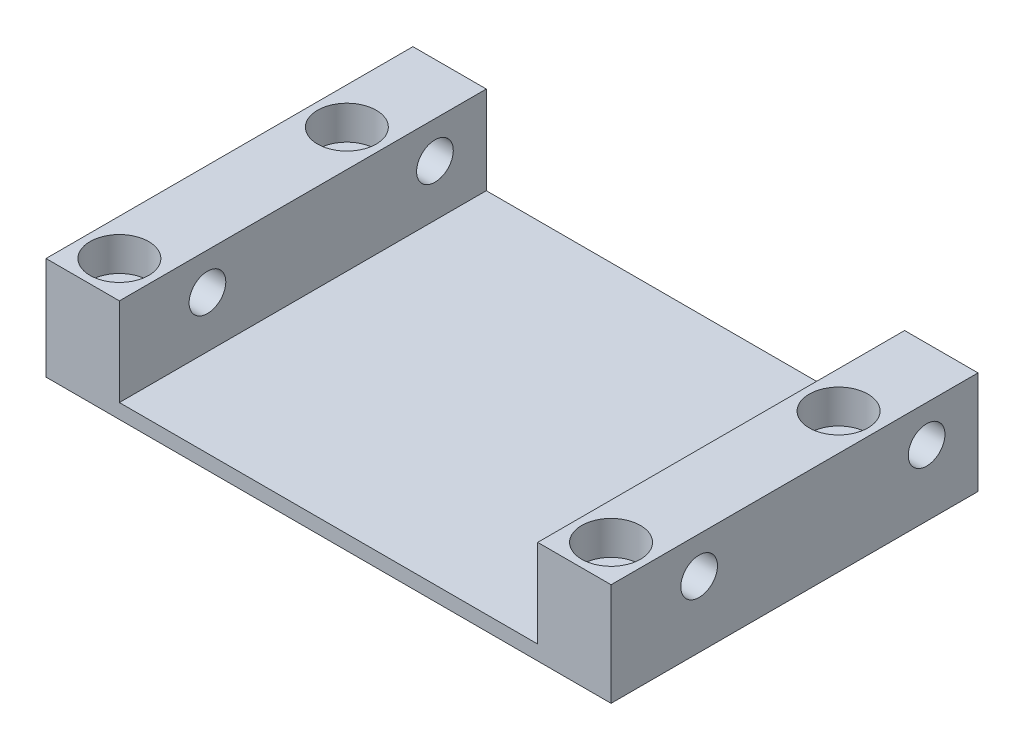
ISO-10303-21;
HEADER;
FILE_DESCRIPTION(('STEP AP214'),'2;1');
FILE_NAME('part.step','',(''),(''),'','','');
FILE_SCHEMA(('AUTOMOTIVE_DESIGN { 1 0 10303 214 1 1 1 1 }'));
ENDSEC;
DATA;
#1=APPLICATION_CONTEXT('core data for automotive mechanical design processes');
#2=APPLICATION_PROTOCOL_DEFINITION('international standard','automotive_design',2000,#1);
#3=PRODUCT_CONTEXT('',#1,'mechanical');
#4=PRODUCT('Part','Part','',(#3));
#5=PRODUCT_RELATED_PRODUCT_CATEGORY('part','',(#4));
#6=PRODUCT_DEFINITION_FORMATION('','',#4);
#7=PRODUCT_DEFINITION_CONTEXT('part definition',#1,'design');
#8=PRODUCT_DEFINITION('design','',#6,#7);
#9=PRODUCT_DEFINITION_SHAPE('','',#8);
#10=(LENGTH_UNIT() NAMED_UNIT(*) SI_UNIT(.MILLI.,.METRE.));
#11=(NAMED_UNIT(*) PLANE_ANGLE_UNIT() SI_UNIT($,.RADIAN.));
#12=(NAMED_UNIT(*) SI_UNIT($,.STERADIAN.) SOLID_ANGLE_UNIT());
#13=UNCERTAINTY_MEASURE_WITH_UNIT(LENGTH_MEASURE(1.E-05),#10,'distance_accuracy_value','');
#14=(GEOMETRIC_REPRESENTATION_CONTEXT(3) GLOBAL_UNCERTAINTY_ASSIGNED_CONTEXT((#13)) GLOBAL_UNIT_ASSIGNED_CONTEXT((#10,
#11,#12)) REPRESENTATION_CONTEXT('',''));
#15=CARTESIAN_POINT('',(0.,0.,0.));
#16=DIRECTION('',(0.,0.,1.));
#17=DIRECTION('',(1.,0.,0.));
#18=AXIS2_PLACEMENT_3D('',#15,#16,#17);
#19=CARTESIAN_POINT('',(-28.5,1.99999999999999,-25.));
#20=DIRECTION('',(0.,1.,0.));
#21=DIRECTION('',(0.,0.,1.));
#22=AXIS2_PLACEMENT_3D('',#19,#20,#21);
#23=PLANE('',#22);
#24=DIRECTION('',(-1.,0.,0.));
#25=VECTOR('',#24,1.);
#26=CARTESIAN_POINT('',(-28.5,1.99999999999999,25.));
#27=LINE('',#26,#25);
#28=CARTESIAN_POINT('',(28.5,1.99999999999999,25.));
#29=VERTEX_POINT('',#28);
#30=CARTESIAN_POINT('',(-28.5,1.99999999999999,25.));
#31=VERTEX_POINT('',#30);
#32=EDGE_CURVE('E144',#29,#31,#27,.T.);
#33=ORIENTED_EDGE('',*,*,#32,.F.);
#34=DIRECTION('',(0.,0.,1.));
#35=VECTOR('',#34,1.);
#36=CARTESIAN_POINT('',(28.5,1.99999999999999,-25.));
#37=LINE('',#36,#35);
#38=CARTESIAN_POINT('',(28.5,1.99999999999999,-25.));
#39=VERTEX_POINT('',#38);
#40=EDGE_CURVE('E11',#39,#29,#37,.T.);
#41=ORIENTED_EDGE('',*,*,#40,.F.);
#42=DIRECTION('',(-1.,0.,0.));
#43=VECTOR('',#42,1.);
#44=CARTESIAN_POINT('',(-28.5,1.99999999999999,-25.));
#45=LINE('',#44,#43);
#46=CARTESIAN_POINT('',(-28.5,1.99999999999999,-25.));
#47=VERTEX_POINT('',#46);
#48=EDGE_CURVE('E167',#39,#47,#45,.T.);
#49=ORIENTED_EDGE('',*,*,#48,.T.);
#50=DIRECTION('',(0.,0.,1.));
#51=VECTOR('',#50,1.);
#52=CARTESIAN_POINT('',(-28.5,1.99999999999999,-25.));
#53=LINE('',#52,#51);
#54=EDGE_CURVE('E95',#47,#31,#53,.T.);
#55=ORIENTED_EDGE('',*,*,#54,.T.);
#56=EDGE_LOOP('',(#33,#41,#49,#55));
#57=FACE_BOUND('',#56,.T.);
#58=ADVANCED_FACE('F37',(#57),#23,.T.);
#59=CARTESIAN_POINT('',(28.5,1.99999999999999,-25.));
#60=DIRECTION('',(-1.,0.,0.));
#61=DIRECTION('',(0.,-1.,0.));
#62=AXIS2_PLACEMENT_3D('',#59,#60,#61);
#63=PLANE('',#62);
#64=CARTESIAN_POINT('',(28.5,8.99999999999999,13.));
#65=DIRECTION('',(-1.,0.,0.));
#66=DIRECTION('',(0.,-1.,0.));
#67=AXIS2_PLACEMENT_3D('',#64,#65,#66);
#68=CIRCLE('',#67,2.5);
#69=CARTESIAN_POINT('',(28.5,6.49999999999999,13.));
#70=VERTEX_POINT('',#69);
#71=EDGE_CURVE('E183',#70,#70,#68,.T.);
#72=ORIENTED_EDGE('',*,*,#71,.F.);
#73=EDGE_LOOP('',(#72));
#74=FACE_BOUND('',#73,.T.);
#75=CARTESIAN_POINT('',(28.5,8.99999999999999,-18.));
#76=DIRECTION('',(-1.,0.,0.));
#77=DIRECTION('',(0.,-1.,0.));
#78=AXIS2_PLACEMENT_3D('',#75,#76,#77);
#79=CIRCLE('',#78,2.5);
#80=CARTESIAN_POINT('',(28.5,6.49999999999999,-18.));
#81=VERTEX_POINT('',#80);
#82=EDGE_CURVE('E148',#81,#81,#79,.T.);
#83=ORIENTED_EDGE('',*,*,#82,.F.);
#84=EDGE_LOOP('',(#83));
#85=FACE_BOUND('',#84,.T.);
#86=DIRECTION('',(0.,-1.,0.));
#87=VECTOR('',#86,1.);
#88=CARTESIAN_POINT('',(28.5,1.99999999999999,25.));
#89=LINE('',#88,#87);
#90=CARTESIAN_POINT('',(28.5,14.,25.));
#91=VERTEX_POINT('',#90);
#92=EDGE_CURVE('E165',#91,#29,#89,.T.);
#93=ORIENTED_EDGE('',*,*,#92,.F.);
#94=DIRECTION('',(0.,0.,1.));
#95=VECTOR('',#94,1.);
#96=CARTESIAN_POINT('',(28.5,14.,-25.));
#97=LINE('',#96,#95);
#98=CARTESIAN_POINT('',(28.5,14.,-25.));
#99=VERTEX_POINT('',#98);
#100=EDGE_CURVE('E46',#99,#91,#97,.T.);
#101=ORIENTED_EDGE('',*,*,#100,.F.);
#102=DIRECTION('',(0.,-1.,0.));
#103=VECTOR('',#102,1.);
#104=CARTESIAN_POINT('',(28.5,1.99999999999999,-25.));
#105=LINE('',#104,#103);
#106=EDGE_CURVE('E129',#99,#39,#105,.T.);
#107=ORIENTED_EDGE('',*,*,#106,.T.);
#108=ORIENTED_EDGE('',*,*,#40,.T.);
#109=EDGE_LOOP('',(#93,#101,#107,#108));
#110=FACE_BOUND('',#109,.T.);
#111=ADVANCED_FACE('F225',(#74,#85,#110),#63,.T.);
#112=CARTESIAN_POINT('',(28.5,14.,-25.));
#113=DIRECTION('',(0.,1.,0.));
#114=DIRECTION('',(-1.,0.,0.));
#115=AXIS2_PLACEMENT_3D('',#112,#113,#114);
#116=PLANE('',#115);
#117=CARTESIAN_POINT('',(33.5,14.,-11.));
#118=DIRECTION('',(0.,1.,0.));
#119=DIRECTION('',(0.,0.,1.));
#120=AXIS2_PLACEMENT_3D('',#117,#118,#119);
#121=CIRCLE('',#120,4.);
#122=CARTESIAN_POINT('',(33.5,14.,-7.00000000000001));
#123=VERTEX_POINT('',#122);
#124=EDGE_CURVE('E314',#123,#123,#121,.T.);
#125=ORIENTED_EDGE('',*,*,#124,.F.);
#126=EDGE_LOOP('',(#125));
#127=FACE_BOUND('',#126,.T.);
#128=CARTESIAN_POINT('',(33.5,14.,20.));
#129=DIRECTION('',(0.,1.,0.));
#130=DIRECTION('',(0.,0.,1.));
#131=AXIS2_PLACEMENT_3D('',#128,#129,#130);
#132=CIRCLE('',#131,4.);
#133=CARTESIAN_POINT('',(33.5,14.,24.));
#134=VERTEX_POINT('',#133);
#135=EDGE_CURVE('E300',#134,#134,#132,.T.);
#136=ORIENTED_EDGE('',*,*,#135,.F.);
#137=EDGE_LOOP('',(#136));
#138=FACE_BOUND('',#137,.T.);
#139=DIRECTION('',(-1.,0.,0.));
#140=VECTOR('',#139,1.);
#141=CARTESIAN_POINT('',(28.5,14.,25.));
#142=LINE('',#141,#140);
#143=CARTESIAN_POINT('',(38.5,14.,25.));
#144=VERTEX_POINT('',#143);
#145=EDGE_CURVE('E115',#144,#91,#142,.T.);
#146=ORIENTED_EDGE('',*,*,#145,.F.);
#147=DIRECTION('',(0.,0.,1.));
#148=VECTOR('',#147,1.);
#149=CARTESIAN_POINT('',(38.5,14.,-25.));
#150=LINE('',#149,#148);
#151=CARTESIAN_POINT('',(38.5,14.,-25.));
#152=VERTEX_POINT('',#151);
#153=EDGE_CURVE('E110',#152,#144,#150,.T.);
#154=ORIENTED_EDGE('',*,*,#153,.F.);
#155=DIRECTION('',(-1.,0.,0.));
#156=VECTOR('',#155,1.);
#157=CARTESIAN_POINT('',(28.5,14.,-25.));
#158=LINE('',#157,#156);
#159=EDGE_CURVE('E113',#152,#99,#158,.T.);
#160=ORIENTED_EDGE('',*,*,#159,.T.);
#161=ORIENTED_EDGE('',*,*,#100,.T.);
#162=EDGE_LOOP('',(#146,#154,#160,#161));
#163=FACE_BOUND('',#162,.T.);
#164=ADVANCED_FACE('F112',(#127,#138,#163),#116,.T.);
#165=CARTESIAN_POINT('',(38.5,14.,-25.));
#166=DIRECTION('',(1.,0.,0.));
#167=DIRECTION('',(0.,0.,-1.));
#168=AXIS2_PLACEMENT_3D('',#165,#166,#167);
#169=PLANE('',#168);
#170=CARTESIAN_POINT('',(38.5,8.99999999999999,13.));
#171=DIRECTION('',(1.,0.,0.));
#172=DIRECTION('',(0.,0.,-1.));
#173=AXIS2_PLACEMENT_3D('',#170,#171,#172);
#174=CIRCLE('',#173,2.5);
#175=CARTESIAN_POINT('',(38.5,8.99999999999999,10.5));
#176=VERTEX_POINT('',#175);
#177=EDGE_CURVE('E191',#176,#176,#174,.T.);
#178=ORIENTED_EDGE('',*,*,#177,.F.);
#179=EDGE_LOOP('',(#178));
#180=FACE_BOUND('',#179,.T.);
#181=CARTESIAN_POINT('',(38.5,8.99999999999999,-18.));
#182=DIRECTION('',(1.,0.,0.));
#183=DIRECTION('',(0.,0.,-1.));
#184=AXIS2_PLACEMENT_3D('',#181,#182,#183);
#185=CIRCLE('',#184,2.5);
#186=CARTESIAN_POINT('',(38.5,8.99999999999999,-20.5));
#187=VERTEX_POINT('',#186);
#188=EDGE_CURVE('E187',#187,#187,#185,.T.);
#189=ORIENTED_EDGE('',*,*,#188,.F.);
#190=EDGE_LOOP('',(#189));
#191=FACE_BOUND('',#190,.T.);
#192=DIRECTION('',(0.,1.,0.));
#193=VECTOR('',#192,1.);
#194=CARTESIAN_POINT('',(38.5,14.,25.));
#195=LINE('',#194,#193);
#196=CARTESIAN_POINT('',(38.5,0.,25.));
#197=VERTEX_POINT('',#196);
#198=EDGE_CURVE('E162',#197,#144,#195,.T.);
#199=ORIENTED_EDGE('',*,*,#198,.F.);
#200=DIRECTION('',(0.,0.,1.));
#201=VECTOR('',#200,1.);
#202=CARTESIAN_POINT('',(38.5,0.,-25.));
#203=LINE('',#202,#201);
#204=CARTESIAN_POINT('',(38.5,0.,-25.));
#205=VERTEX_POINT('',#204);
#206=EDGE_CURVE('E121',#205,#197,#203,.T.);
#207=ORIENTED_EDGE('',*,*,#206,.F.);
#208=DIRECTION('',(0.,1.,0.));
#209=VECTOR('',#208,1.);
#210=CARTESIAN_POINT('',(38.5,14.,-25.));
#211=LINE('',#210,#209);
#212=EDGE_CURVE('E127',#205,#152,#211,.T.);
#213=ORIENTED_EDGE('',*,*,#212,.T.);
#214=ORIENTED_EDGE('',*,*,#153,.T.);
#215=EDGE_LOOP('',(#199,#207,#213,#214));
#216=FACE_BOUND('',#215,.T.);
#217=ADVANCED_FACE('F132',(#180,#191,#216),#169,.T.);
#218=CARTESIAN_POINT('',(38.5,0.,-25.));
#219=DIRECTION('',(0.,-1.,0.));
#220=DIRECTION('',(0.,0.,-1.));
#221=AXIS2_PLACEMENT_3D('',#218,#219,#220);
#222=PLANE('',#221);
#223=CARTESIAN_POINT('',(33.5,0.,-11.));
#224=DIRECTION('',(0.,1.,0.));
#225=DIRECTION('',(0.,0.,1.));
#226=AXIS2_PLACEMENT_3D('',#223,#224,#225);
#227=CIRCLE('',#226,2.25);
#228=CARTESIAN_POINT('',(33.5,0.,-8.75000000000001));
#229=VERTEX_POINT('',#228);
#230=EDGE_CURVE('E303',#229,#229,#227,.T.);
#231=ORIENTED_EDGE('',*,*,#230,.T.);
#232=EDGE_LOOP('',(#231));
#233=FACE_BOUND('',#232,.T.);
#234=CARTESIAN_POINT('',(33.5,0.,20.));
#235=DIRECTION('',(0.,1.,0.));
#236=DIRECTION('',(0.,0.,1.));
#237=AXIS2_PLACEMENT_3D('',#234,#235,#236);
#238=CIRCLE('',#237,2.25);
#239=CARTESIAN_POINT('',(33.5,0.,22.25));
#240=VERTEX_POINT('',#239);
#241=EDGE_CURVE('E291',#240,#240,#238,.T.);
#242=ORIENTED_EDGE('',*,*,#241,.T.);
#243=EDGE_LOOP('',(#242));
#244=FACE_BOUND('',#243,.T.);
#245=CARTESIAN_POINT('',(-33.5,0.,-11.));
#246=DIRECTION('',(0.,1.,0.));
#247=DIRECTION('',(0.,0.,1.));
#248=AXIS2_PLACEMENT_3D('',#245,#246,#247);
#249=CIRCLE('',#248,2.25);
#250=CARTESIAN_POINT('',(-33.5,0.,-8.75000000000001));
#251=VERTEX_POINT('',#250);
#252=EDGE_CURVE('E279',#251,#251,#249,.T.);
#253=ORIENTED_EDGE('',*,*,#252,.T.);
#254=EDGE_LOOP('',(#253));
#255=FACE_BOUND('',#254,.T.);
#256=CARTESIAN_POINT('',(-33.5,0.,20.));
#257=DIRECTION('',(0.,1.,0.));
#258=DIRECTION('',(0.,0.,1.));
#259=AXIS2_PLACEMENT_3D('',#256,#257,#258);
#260=CIRCLE('',#259,2.25);
#261=CARTESIAN_POINT('',(-33.5,0.,22.25));
#262=VERTEX_POINT('',#261);
#263=EDGE_CURVE('E261',#262,#262,#260,.T.);
#264=ORIENTED_EDGE('',*,*,#263,.T.);
#265=EDGE_LOOP('',(#264));
#266=FACE_BOUND('',#265,.T.);
#267=DIRECTION('',(1.,0.,0.));
#268=VECTOR('',#267,1.);
#269=CARTESIAN_POINT('',(38.5,0.,25.));
#270=LINE('',#269,#268);
#271=CARTESIAN_POINT('',(-38.5,0.,25.));
#272=VERTEX_POINT('',#271);
#273=EDGE_CURVE('E159',#272,#197,#270,.T.);
#274=ORIENTED_EDGE('',*,*,#273,.F.);
#275=DIRECTION('',(0.,0.,1.));
#276=VECTOR('',#275,1.);
#277=CARTESIAN_POINT('',(-38.5,0.,-25.));
#278=LINE('',#277,#276);
#279=CARTESIAN_POINT('',(-38.5,0.,-25.));
#280=VERTEX_POINT('',#279);
#281=EDGE_CURVE('E172',#280,#272,#278,.T.);
#282=ORIENTED_EDGE('',*,*,#281,.F.);
#283=DIRECTION('',(1.,0.,0.));
#284=VECTOR('',#283,1.);
#285=CARTESIAN_POINT('',(38.5,0.,-25.));
#286=LINE('',#285,#284);
#287=EDGE_CURVE('E134',#280,#205,#286,.T.);
#288=ORIENTED_EDGE('',*,*,#287,.T.);
#289=ORIENTED_EDGE('',*,*,#206,.T.);
#290=EDGE_LOOP('',(#274,#282,#288,#289));
#291=FACE_BOUND('',#290,.T.);
#292=ADVANCED_FACE('F241',(#233,#244,#255,#266,#291),#222,.T.);
#293=CARTESIAN_POINT('',(-38.5,14.,-25.));
#294=DIRECTION('',(-1.,0.,0.));
#295=DIRECTION('',(0.,0.,1.));
#296=AXIS2_PLACEMENT_3D('',#293,#294,#295);
#297=PLANE('',#296);
#298=CARTESIAN_POINT('',(-38.5,8.99999999999999,13.));
#299=DIRECTION('',(-1.,0.,0.));
#300=DIRECTION('',(0.,0.,1.));
#301=AXIS2_PLACEMENT_3D('',#298,#299,#300);
#302=CIRCLE('',#301,2.5);
#303=CARTESIAN_POINT('',(-38.5,8.99999999999999,15.5));
#304=VERTEX_POINT('',#303);
#305=EDGE_CURVE('E198',#304,#304,#302,.T.);
#306=ORIENTED_EDGE('',*,*,#305,.F.);
#307=EDGE_LOOP('',(#306));
#308=FACE_BOUND('',#307,.T.);
#309=CARTESIAN_POINT('',(-38.5,8.99999999999999,-18.));
#310=DIRECTION('',(-1.,0.,0.));
#311=DIRECTION('',(0.,0.,1.));
#312=AXIS2_PLACEMENT_3D('',#309,#310,#311);
#313=CIRCLE('',#312,2.5);
#314=CARTESIAN_POINT('',(-38.5,8.99999999999999,-15.5));
#315=VERTEX_POINT('',#314);
#316=EDGE_CURVE('E182',#315,#315,#313,.T.);
#317=ORIENTED_EDGE('',*,*,#316,.F.);
#318=EDGE_LOOP('',(#317));
#319=FACE_BOUND('',#318,.T.);
#320=DIRECTION('',(0.,-1.,0.));
#321=VECTOR('',#320,1.);
#322=CARTESIAN_POINT('',(-38.5,14.,25.));
#323=LINE('',#322,#321);
#324=CARTESIAN_POINT('',(-38.5,14.,25.));
#325=VERTEX_POINT('',#324);
#326=EDGE_CURVE('E155',#325,#272,#323,.T.);
#327=ORIENTED_EDGE('',*,*,#326,.F.);
#328=DIRECTION('',(0.,0.,1.));
#329=VECTOR('',#328,1.);
#330=CARTESIAN_POINT('',(-38.5,14.,-25.));
#331=LINE('',#330,#329);
#332=CARTESIAN_POINT('',(-38.5,14.,-25.));
#333=VERTEX_POINT('',#332);
#334=EDGE_CURVE('E174',#333,#325,#331,.T.);
#335=ORIENTED_EDGE('',*,*,#334,.F.);
#336=DIRECTION('',(0.,-1.,0.));
#337=VECTOR('',#336,1.);
#338=CARTESIAN_POINT('',(-38.5,14.,-25.));
#339=LINE('',#338,#337);
#340=EDGE_CURVE('E138',#333,#280,#339,.T.);
#341=ORIENTED_EDGE('',*,*,#340,.T.);
#342=ORIENTED_EDGE('',*,*,#281,.T.);
#343=EDGE_LOOP('',(#327,#335,#341,#342));
#344=FACE_BOUND('',#343,.T.);
#345=ADVANCED_FACE('F216',(#308,#319,#344),#297,.T.);
#346=CARTESIAN_POINT('',(-28.5,14.,-25.));
#347=DIRECTION('',(0.,1.,0.));
#348=DIRECTION('',(-1.,0.,0.));
#349=AXIS2_PLACEMENT_3D('',#346,#347,#348);
#350=PLANE('',#349);
#351=CARTESIAN_POINT('',(-33.5,14.,-11.));
#352=DIRECTION('',(0.,1.,0.));
#353=DIRECTION('',(0.,0.,1.));
#354=AXIS2_PLACEMENT_3D('',#351,#352,#353);
#355=CIRCLE('',#354,4.);
#356=CARTESIAN_POINT('',(-33.5,14.,-7.));
#357=VERTEX_POINT('',#356);
#358=EDGE_CURVE('E288',#357,#357,#355,.T.);
#359=ORIENTED_EDGE('',*,*,#358,.F.);
#360=EDGE_LOOP('',(#359));
#361=FACE_BOUND('',#360,.T.);
#362=CARTESIAN_POINT('',(-33.5,14.,20.));
#363=DIRECTION('',(0.,1.,0.));
#364=DIRECTION('',(0.,0.,1.));
#365=AXIS2_PLACEMENT_3D('',#362,#363,#364);
#366=CIRCLE('',#365,4.);
#367=CARTESIAN_POINT('',(-33.5,14.,24.));
#368=VERTEX_POINT('',#367);
#369=EDGE_CURVE('E275',#368,#368,#366,.T.);
#370=ORIENTED_EDGE('',*,*,#369,.F.);
#371=EDGE_LOOP('',(#370));
#372=FACE_BOUND('',#371,.T.);
#373=DIRECTION('',(-1.,0.,0.));
#374=VECTOR('',#373,1.);
#375=CARTESIAN_POINT('',(-28.5,14.,25.));
#376=LINE('',#375,#374);
#377=CARTESIAN_POINT('',(-28.5,14.,25.));
#378=VERTEX_POINT('',#377);
#379=EDGE_CURVE('E151',#378,#325,#376,.T.);
#380=ORIENTED_EDGE('',*,*,#379,.F.);
#381=DIRECTION('',(0.,0.,1.));
#382=VECTOR('',#381,1.);
#383=CARTESIAN_POINT('',(-28.5,14.,-25.));
#384=LINE('',#383,#382);
#385=CARTESIAN_POINT('',(-28.5,14.,-25.));
#386=VERTEX_POINT('',#385);
#387=EDGE_CURVE('E177',#386,#378,#384,.T.);
#388=ORIENTED_EDGE('',*,*,#387,.F.);
#389=DIRECTION('',(-1.,0.,0.));
#390=VECTOR('',#389,1.);
#391=CARTESIAN_POINT('',(-28.5,14.,-25.));
#392=LINE('',#391,#390);
#393=EDGE_CURVE('E210',#386,#333,#392,.T.);
#394=ORIENTED_EDGE('',*,*,#393,.T.);
#395=ORIENTED_EDGE('',*,*,#334,.T.);
#396=EDGE_LOOP('',(#380,#388,#394,#395));
#397=FACE_BOUND('',#396,.T.);
#398=ADVANCED_FACE('F221',(#361,#372,#397),#350,.T.);
#399=CARTESIAN_POINT('',(-28.5,1.99999999999999,-25.));
#400=DIRECTION('',(1.,0.,0.));
#401=DIRECTION('',(0.,1.,0.));
#402=AXIS2_PLACEMENT_3D('',#399,#400,#401);
#403=PLANE('',#402);
#404=CARTESIAN_POINT('',(-28.5,8.99999999999999,13.));
#405=DIRECTION('',(1.,0.,0.));
#406=DIRECTION('',(0.,1.,0.));
#407=AXIS2_PLACEMENT_3D('',#404,#405,#406);
#408=CIRCLE('',#407,2.5);
#409=CARTESIAN_POINT('',(-28.5,11.5,13.));
#410=VERTEX_POINT('',#409);
#411=EDGE_CURVE('E40',#410,#410,#408,.T.);
#412=ORIENTED_EDGE('',*,*,#411,.F.);
#413=EDGE_LOOP('',(#412));
#414=FACE_BOUND('',#413,.T.);
#415=CARTESIAN_POINT('',(-28.5,8.99999999999999,-18.));
#416=DIRECTION('',(1.,0.,0.));
#417=DIRECTION('',(0.,1.,0.));
#418=AXIS2_PLACEMENT_3D('',#415,#416,#417);
#419=CIRCLE('',#418,2.5);
#420=CARTESIAN_POINT('',(-28.5,11.5,-18.));
#421=VERTEX_POINT('',#420);
#422=EDGE_CURVE('E180',#421,#421,#419,.T.);
#423=ORIENTED_EDGE('',*,*,#422,.F.);
#424=EDGE_LOOP('',(#423));
#425=FACE_BOUND('',#424,.T.);
#426=DIRECTION('',(0.,1.,0.));
#427=VECTOR('',#426,1.);
#428=CARTESIAN_POINT('',(-28.5,1.99999999999999,25.));
#429=LINE('',#428,#427);
#430=EDGE_CURVE('E147',#31,#378,#429,.T.);
#431=ORIENTED_EDGE('',*,*,#430,.F.);
#432=ORIENTED_EDGE('',*,*,#54,.F.);
#433=DIRECTION('',(0.,1.,0.));
#434=VECTOR('',#433,1.);
#435=CARTESIAN_POINT('',(-28.5,1.99999999999999,-25.));
#436=LINE('',#435,#434);
#437=EDGE_CURVE('E208',#47,#386,#436,.T.);
#438=ORIENTED_EDGE('',*,*,#437,.T.);
#439=ORIENTED_EDGE('',*,*,#387,.T.);
#440=EDGE_LOOP('',(#431,#432,#438,#439));
#441=FACE_BOUND('',#440,.T.);
#442=ADVANCED_FACE('F222',(#414,#425,#441),#403,.T.);
#443=CARTESIAN_POINT('',(28.5,1.99999999999999,-25.));
#444=DIRECTION('',(0.,0.,1.));
#445=DIRECTION('',(1.,0.,0.));
#446=AXIS2_PLACEMENT_3D('',#443,#444,#445);
#447=PLANE('',#446);
#448=ORIENTED_EDGE('',*,*,#48,.F.);
#449=ORIENTED_EDGE('',*,*,#106,.F.);
#450=ORIENTED_EDGE('',*,*,#159,.F.);
#451=ORIENTED_EDGE('',*,*,#212,.F.);
#452=ORIENTED_EDGE('',*,*,#287,.F.);
#453=ORIENTED_EDGE('',*,*,#340,.F.);
#454=ORIENTED_EDGE('',*,*,#393,.F.);
#455=ORIENTED_EDGE('',*,*,#437,.F.);
#456=EDGE_LOOP('',(#448,#449,#450,#451,#452,#453,#454,#455));
#457=FACE_BOUND('',#456,.T.);
#458=ADVANCED_FACE('F125',(#457),#447,.F.);
#459=CARTESIAN_POINT('',(28.5,1.99999999999999,25.));
#460=DIRECTION('',(0.,0.,1.));
#461=DIRECTION('',(1.,0.,0.));
#462=AXIS2_PLACEMENT_3D('',#459,#460,#461);
#463=PLANE('',#462);
#464=ORIENTED_EDGE('',*,*,#32,.T.);
#465=ORIENTED_EDGE('',*,*,#430,.T.);
#466=ORIENTED_EDGE('',*,*,#379,.T.);
#467=ORIENTED_EDGE('',*,*,#326,.T.);
#468=ORIENTED_EDGE('',*,*,#273,.T.);
#469=ORIENTED_EDGE('',*,*,#198,.T.);
#470=ORIENTED_EDGE('',*,*,#145,.T.);
#471=ORIENTED_EDGE('',*,*,#92,.T.);
#472=EDGE_LOOP('',(#464,#465,#466,#467,#468,#469,#470,#471));
#473=FACE_BOUND('',#472,.T.);
#474=ADVANCED_FACE('F224',(#473),#463,.T.);
#475=CARTESIAN_POINT('',(-50.,8.99999999999999,-18.));
#476=DIRECTION('',(1.,0.,0.));
#477=DIRECTION('',(0.,0.,-1.));
#478=AXIS2_PLACEMENT_3D('',#475,#476,#477);
#479=CYLINDRICAL_SURFACE('',#478,2.5);
#480=ORIENTED_EDGE('',*,*,#316,.T.);
#481=EDGE_LOOP('',(#480));
#482=FACE_BOUND('',#481,.T.);
#483=ORIENTED_EDGE('',*,*,#422,.T.);
#484=EDGE_LOOP('',(#483));
#485=FACE_BOUND('',#484,.T.);
#486=ADVANCED_FACE('F375',(#482,#485),#479,.F.);
#487=ORIENTED_EDGE('',*,*,#82,.T.);
#488=EDGE_LOOP('',(#487));
#489=FACE_BOUND('',#488,.T.);
#490=ORIENTED_EDGE('',*,*,#188,.T.);
#491=EDGE_LOOP('',(#490));
#492=FACE_BOUND('',#491,.T.);
#493=ADVANCED_FACE('F373',(#489,#492),#479,.F.);
#494=CARTESIAN_POINT('',(-50.,8.99999999999999,13.));
#495=DIRECTION('',(1.,0.,0.));
#496=DIRECTION('',(0.,0.,-1.));
#497=AXIS2_PLACEMENT_3D('',#494,#495,#496);
#498=CYLINDRICAL_SURFACE('',#497,2.5);
#499=ORIENTED_EDGE('',*,*,#305,.T.);
#500=EDGE_LOOP('',(#499));
#501=FACE_BOUND('',#500,.T.);
#502=ORIENTED_EDGE('',*,*,#411,.T.);
#503=EDGE_LOOP('',(#502));
#504=FACE_BOUND('',#503,.T.);
#505=ADVANCED_FACE('F370',(#501,#504),#498,.F.);
#506=ORIENTED_EDGE('',*,*,#71,.T.);
#507=EDGE_LOOP('',(#506));
#508=FACE_BOUND('',#507,.T.);
#509=ORIENTED_EDGE('',*,*,#177,.T.);
#510=EDGE_LOOP('',(#509));
#511=FACE_BOUND('',#510,.T.);
#512=ADVANCED_FACE('F368',(#508,#511),#498,.F.);
#513=CARTESIAN_POINT('',(-33.5,14.,20.));
#514=DIRECTION('',(0.,1.,0.));
#515=DIRECTION('',(0.,0.,1.));
#516=AXIS2_PLACEMENT_3D('',#513,#514,#515);
#517=CYLINDRICAL_SURFACE('',#516,2.25);
#518=ORIENTED_EDGE('',*,*,#263,.F.);
#519=EDGE_LOOP('',(#518));
#520=FACE_BOUND('',#519,.T.);
#521=CARTESIAN_POINT('',(-33.5,9.39999999999999,20.));
#522=DIRECTION('',(0.,1.,0.));
#523=DIRECTION('',(0.,0.,1.));
#524=AXIS2_PLACEMENT_3D('',#521,#522,#523);
#525=CIRCLE('',#524,2.25);
#526=CARTESIAN_POINT('',(-33.5,9.39999999999999,22.25));
#527=VERTEX_POINT('',#526);
#528=EDGE_CURVE('E265',#527,#527,#525,.T.);
#529=ORIENTED_EDGE('',*,*,#528,.T.);
#530=EDGE_LOOP('',(#529));
#531=FACE_BOUND('',#530,.T.);
#532=ADVANCED_FACE('F364',(#520,#531),#517,.F.);
#533=CARTESIAN_POINT('',(-31.25,9.39999999999999,20.));
#534=DIRECTION('',(0.,-1.,0.));
#535=DIRECTION('',(0.,0.,-1.));
#536=AXIS2_PLACEMENT_3D('',#533,#534,#535);
#537=PLANE('',#536);
#538=ORIENTED_EDGE('',*,*,#528,.F.);
#539=EDGE_LOOP('',(#538));
#540=FACE_BOUND('',#539,.T.);
#541=CARTESIAN_POINT('',(-33.5,9.39999999999999,20.));
#542=DIRECTION('',(0.,1.,0.));
#543=DIRECTION('',(0.,0.,1.));
#544=AXIS2_PLACEMENT_3D('',#541,#542,#543);
#545=CIRCLE('',#544,4.);
#546=CARTESIAN_POINT('',(-33.5,9.39999999999999,24.));
#547=VERTEX_POINT('',#546);
#548=EDGE_CURVE('E270',#547,#547,#545,.T.);
#549=ORIENTED_EDGE('',*,*,#548,.T.);
#550=EDGE_LOOP('',(#549));
#551=FACE_BOUND('',#550,.T.);
#552=ADVANCED_FACE('F360',(#540,#551),#537,.F.);
#553=CARTESIAN_POINT('',(-33.5,14.,20.));
#554=DIRECTION('',(0.,1.,0.));
#555=DIRECTION('',(0.,0.,1.));
#556=AXIS2_PLACEMENT_3D('',#553,#554,#555);
#557=CYLINDRICAL_SURFACE('',#556,4.);
#558=ORIENTED_EDGE('',*,*,#548,.F.);
#559=EDGE_LOOP('',(#558));
#560=FACE_BOUND('',#559,.T.);
#561=ORIENTED_EDGE('',*,*,#369,.T.);
#562=EDGE_LOOP('',(#561));
#563=FACE_BOUND('',#562,.T.);
#564=ADVANCED_FACE('F356',(#560,#563),#557,.F.);
#565=CARTESIAN_POINT('',(-33.5,14.,-11.));
#566=DIRECTION('',(0.,1.,0.));
#567=DIRECTION('',(0.,0.,1.));
#568=AXIS2_PLACEMENT_3D('',#565,#566,#567);
#569=CYLINDRICAL_SURFACE('',#568,2.25);
#570=ORIENTED_EDGE('',*,*,#252,.F.);
#571=EDGE_LOOP('',(#570));
#572=FACE_BOUND('',#571,.T.);
#573=CARTESIAN_POINT('',(-33.5,9.39999999999999,-11.));
#574=DIRECTION('',(0.,1.,0.));
#575=DIRECTION('',(0.,0.,1.));
#576=AXIS2_PLACEMENT_3D('',#573,#574,#575);
#577=CIRCLE('',#576,2.25);
#578=CARTESIAN_POINT('',(-33.5,9.39999999999999,-8.75));
#579=VERTEX_POINT('',#578);
#580=EDGE_CURVE('E282',#579,#579,#577,.T.);
#581=ORIENTED_EDGE('',*,*,#580,.T.);
#582=EDGE_LOOP('',(#581));
#583=FACE_BOUND('',#582,.T.);
#584=ADVANCED_FACE('F352',(#572,#583),#569,.F.);
#585=CARTESIAN_POINT('',(-31.25,9.39999999999999,-11.));
#586=DIRECTION('',(0.,-1.,0.));
#587=DIRECTION('',(0.,0.,-1.));
#588=AXIS2_PLACEMENT_3D('',#585,#586,#587);
#589=PLANE('',#588);
#590=ORIENTED_EDGE('',*,*,#580,.F.);
#591=EDGE_LOOP('',(#590));
#592=FACE_BOUND('',#591,.T.);
#593=CARTESIAN_POINT('',(-33.5,9.39999999999999,-11.));
#594=DIRECTION('',(0.,1.,0.));
#595=DIRECTION('',(0.,0.,1.));
#596=AXIS2_PLACEMENT_3D('',#593,#594,#595);
#597=CIRCLE('',#596,4.);
#598=CARTESIAN_POINT('',(-33.5,9.39999999999999,-7.00000000000001));
#599=VERTEX_POINT('',#598);
#600=EDGE_CURVE('E285',#599,#599,#597,.T.);
#601=ORIENTED_EDGE('',*,*,#600,.T.);
#602=EDGE_LOOP('',(#601));
#603=FACE_BOUND('',#602,.T.);
#604=ADVANCED_FACE('F348',(#592,#603),#589,.F.);
#605=CARTESIAN_POINT('',(-33.5,14.,-11.));
#606=DIRECTION('',(0.,1.,0.));
#607=DIRECTION('',(0.,0.,1.));
#608=AXIS2_PLACEMENT_3D('',#605,#606,#607);
#609=CYLINDRICAL_SURFACE('',#608,4.);
#610=ORIENTED_EDGE('',*,*,#600,.F.);
#611=EDGE_LOOP('',(#610));
#612=FACE_BOUND('',#611,.T.);
#613=ORIENTED_EDGE('',*,*,#358,.T.);
#614=EDGE_LOOP('',(#613));
#615=FACE_BOUND('',#614,.T.);
#616=ADVANCED_FACE('F344',(#612,#615),#609,.F.);
#617=CARTESIAN_POINT('',(33.5,14.,20.));
#618=DIRECTION('',(0.,1.,0.));
#619=DIRECTION('',(0.,0.,1.));
#620=AXIS2_PLACEMENT_3D('',#617,#618,#619);
#621=CYLINDRICAL_SURFACE('',#620,2.25);
#622=ORIENTED_EDGE('',*,*,#241,.F.);
#623=EDGE_LOOP('',(#622));
#624=FACE_BOUND('',#623,.T.);
#625=CARTESIAN_POINT('',(33.5,9.39999999999999,20.));
#626=DIRECTION('',(0.,1.,0.));
#627=DIRECTION('',(0.,0.,1.));
#628=AXIS2_PLACEMENT_3D('',#625,#626,#627);
#629=CIRCLE('',#628,2.25);
#630=CARTESIAN_POINT('',(33.5,9.39999999999999,22.25));
#631=VERTEX_POINT('',#630);
#632=EDGE_CURVE('E294',#631,#631,#629,.T.);
#633=ORIENTED_EDGE('',*,*,#632,.T.);
#634=EDGE_LOOP('',(#633));
#635=FACE_BOUND('',#634,.T.);
#636=ADVANCED_FACE('F336',(#624,#635),#621,.F.);
#637=CARTESIAN_POINT('',(35.75,9.39999999999999,20.));
#638=DIRECTION('',(0.,-1.,0.));
#639=DIRECTION('',(0.,0.,-1.));
#640=AXIS2_PLACEMENT_3D('',#637,#638,#639);
#641=PLANE('',#640);
#642=ORIENTED_EDGE('',*,*,#632,.F.);
#643=EDGE_LOOP('',(#642));
#644=FACE_BOUND('',#643,.T.);
#645=CARTESIAN_POINT('',(33.5,9.39999999999999,20.));
#646=DIRECTION('',(0.,1.,0.));
#647=DIRECTION('',(0.,0.,1.));
#648=AXIS2_PLACEMENT_3D('',#645,#646,#647);
#649=CIRCLE('',#648,4.);
#650=CARTESIAN_POINT('',(33.5,9.39999999999999,24.));
#651=VERTEX_POINT('',#650);
#652=EDGE_CURVE('E297',#651,#651,#649,.T.);
#653=ORIENTED_EDGE('',*,*,#652,.T.);
#654=EDGE_LOOP('',(#653));
#655=FACE_BOUND('',#654,.T.);
#656=ADVANCED_FACE('F326',(#644,#655),#641,.F.);
#657=CARTESIAN_POINT('',(33.5,14.,20.));
#658=DIRECTION('',(0.,1.,0.));
#659=DIRECTION('',(0.,0.,1.));
#660=AXIS2_PLACEMENT_3D('',#657,#658,#659);
#661=CYLINDRICAL_SURFACE('',#660,4.);
#662=ORIENTED_EDGE('',*,*,#652,.F.);
#663=EDGE_LOOP('',(#662));
#664=FACE_BOUND('',#663,.T.);
#665=ORIENTED_EDGE('',*,*,#135,.T.);
#666=EDGE_LOOP('',(#665));
#667=FACE_BOUND('',#666,.T.);
#668=ADVANCED_FACE('F323',(#664,#667),#661,.F.);
#669=CARTESIAN_POINT('',(33.5,14.,-11.));
#670=DIRECTION('',(0.,1.,0.));
#671=DIRECTION('',(0.,0.,1.));
#672=AXIS2_PLACEMENT_3D('',#669,#670,#671);
#673=CYLINDRICAL_SURFACE('',#672,2.25);
#674=ORIENTED_EDGE('',*,*,#230,.F.);
#675=EDGE_LOOP('',(#674));
#676=FACE_BOUND('',#675,.T.);
#677=CARTESIAN_POINT('',(33.5,9.39999999999999,-11.));
#678=DIRECTION('',(0.,1.,0.));
#679=DIRECTION('',(0.,0.,1.));
#680=AXIS2_PLACEMENT_3D('',#677,#678,#679);
#681=CIRCLE('',#680,2.25);
#682=CARTESIAN_POINT('',(33.5,9.39999999999999,-8.75));
#683=VERTEX_POINT('',#682);
#684=EDGE_CURVE('E306',#683,#683,#681,.T.);
#685=ORIENTED_EDGE('',*,*,#684,.T.);
#686=EDGE_LOOP('',(#685));
#687=FACE_BOUND('',#686,.T.);
#688=ADVANCED_FACE('F325',(#676,#687),#673,.F.);
#689=CARTESIAN_POINT('',(35.75,9.39999999999999,-11.));
#690=DIRECTION('',(0.,-1.,0.));
#691=DIRECTION('',(0.,0.,-1.));
#692=AXIS2_PLACEMENT_3D('',#689,#690,#691);
#693=PLANE('',#692);
#694=ORIENTED_EDGE('',*,*,#684,.F.);
#695=EDGE_LOOP('',(#694));
#696=FACE_BOUND('',#695,.T.);
#697=CARTESIAN_POINT('',(33.5,9.39999999999999,-11.));
#698=DIRECTION('',(0.,1.,0.));
#699=DIRECTION('',(0.,0.,1.));
#700=AXIS2_PLACEMENT_3D('',#697,#698,#699);
#701=CIRCLE('',#700,4.);
#702=CARTESIAN_POINT('',(33.5,9.39999999999999,-7.00000000000001));
#703=VERTEX_POINT('',#702);
#704=EDGE_CURVE('E310',#703,#703,#701,.T.);
#705=ORIENTED_EDGE('',*,*,#704,.T.);
#706=EDGE_LOOP('',(#705));
#707=FACE_BOUND('',#706,.T.);
#708=ADVANCED_FACE('F333',(#696,#707),#693,.F.);
#709=CARTESIAN_POINT('',(33.5,14.,-11.));
#710=DIRECTION('',(0.,1.,0.));
#711=DIRECTION('',(0.,0.,1.));
#712=AXIS2_PLACEMENT_3D('',#709,#710,#711);
#713=CYLINDRICAL_SURFACE('',#712,4.);
#714=ORIENTED_EDGE('',*,*,#704,.F.);
#715=EDGE_LOOP('',(#714));
#716=FACE_BOUND('',#715,.T.);
#717=ORIENTED_EDGE('',*,*,#124,.T.);
#718=EDGE_LOOP('',(#717));
#719=FACE_BOUND('',#718,.T.);
#720=ADVANCED_FACE('F319',(#716,#719),#713,.F.);
#721=CLOSED_SHELL('',(#58,#111,#164,#217,#292,#345,#398,#442,#458,#474,#486,#493,#505,#512,#532,
#552,#564,#584,#604,#616,#636,#656,#668,#688,#708,#720));
#722=MANIFOLD_SOLID_BREP('B2',#721);
#723=ADVANCED_BREP_SHAPE_REPRESENTATION('',(#18,#722),#14);
#724=SHAPE_DEFINITION_REPRESENTATION(#9,#723);
ENDSEC;
END-ISO-10303-21;
